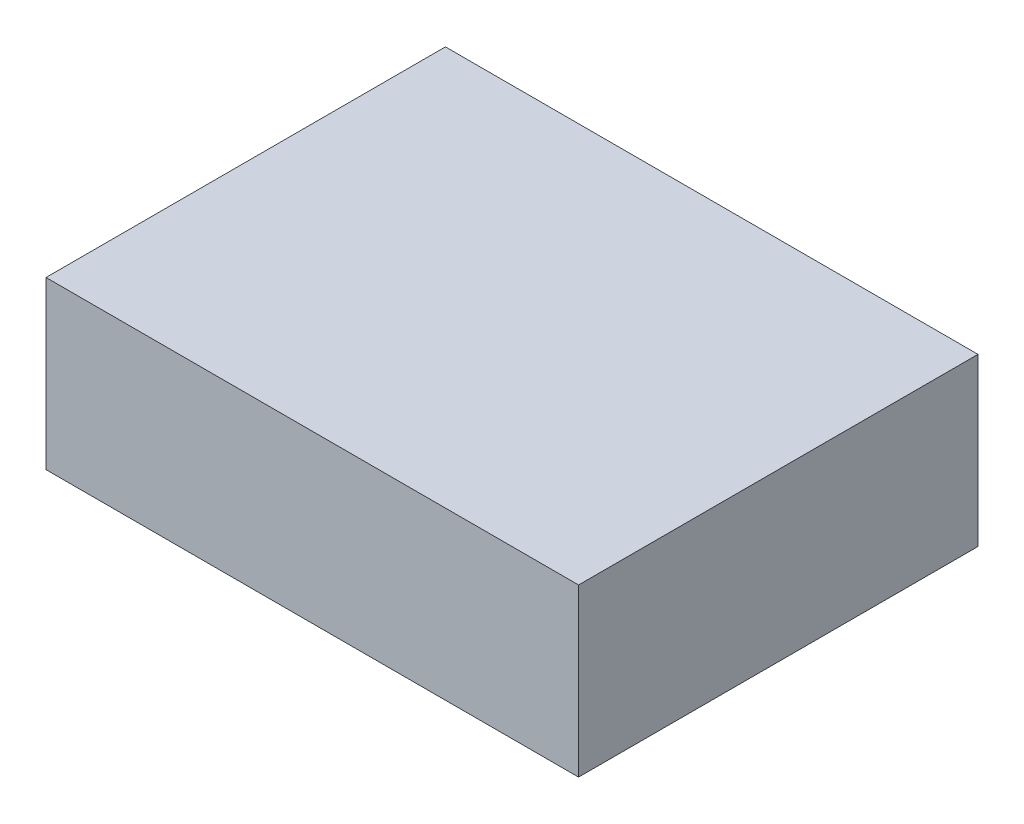
ISO-10303-21;
HEADER;
FILE_DESCRIPTION(('STEP AP214'),'2;1');
FILE_NAME('part.step','',(''),(''),'','','');
FILE_SCHEMA(('AUTOMOTIVE_DESIGN { 1 0 10303 214 1 1 1 1 }'));
ENDSEC;
DATA;
#1=APPLICATION_CONTEXT('core data for automotive mechanical design processes');
#2=APPLICATION_PROTOCOL_DEFINITION('international standard','automotive_design',2000,#1);
#3=PRODUCT_CONTEXT('',#1,'mechanical');
#4=PRODUCT('Part','Part','',(#3));
#5=PRODUCT_RELATED_PRODUCT_CATEGORY('part','',(#4));
#6=PRODUCT_DEFINITION_FORMATION('','',#4);
#7=PRODUCT_DEFINITION_CONTEXT('part definition',#1,'design');
#8=PRODUCT_DEFINITION('design','',#6,#7);
#9=PRODUCT_DEFINITION_SHAPE('','',#8);
#10=(LENGTH_UNIT() NAMED_UNIT(*) SI_UNIT(.MILLI.,.METRE.));
#11=(NAMED_UNIT(*) PLANE_ANGLE_UNIT() SI_UNIT($,.RADIAN.));
#12=(NAMED_UNIT(*) SI_UNIT($,.STERADIAN.) SOLID_ANGLE_UNIT());
#13=UNCERTAINTY_MEASURE_WITH_UNIT(LENGTH_MEASURE(1.E-05),#10,'distance_accuracy_value','');
#14=(GEOMETRIC_REPRESENTATION_CONTEXT(3) GLOBAL_UNCERTAINTY_ASSIGNED_CONTEXT((#13)) GLOBAL_UNIT_ASSIGNED_CONTEXT((#10,
#11,#12)) REPRESENTATION_CONTEXT('',''));
#15=CARTESIAN_POINT('',(0.,0.,0.));
#16=DIRECTION('',(0.,0.,1.));
#17=DIRECTION('',(1.,0.,0.));
#18=AXIS2_PLACEMENT_3D('',#15,#16,#17);
#19=CARTESIAN_POINT('',(160.,100.,-120.));
#20=DIRECTION('',(-1.,0.,0.));
#21=DIRECTION('',(0.,0.,1.));
#22=AXIS2_PLACEMENT_3D('',#19,#20,#21);
#23=PLANE('',#22);
#24=DIRECTION('',(0.,0.,-1.));
#25=VECTOR('',#24,1.);
#26=CARTESIAN_POINT('',(160.,0.,-120.));
#27=LINE('',#26,#25);
#28=CARTESIAN_POINT('',(160.,0.,120.));
#29=VERTEX_POINT('',#28);
#30=CARTESIAN_POINT('',(160.,0.,-120.));
#31=VERTEX_POINT('',#30);
#32=EDGE_CURVE('E109',#29,#31,#27,.T.);
#33=ORIENTED_EDGE('',*,*,#32,.T.);
#34=DIRECTION('',(0.,-1.,0.));
#35=VECTOR('',#34,1.);
#36=CARTESIAN_POINT('',(160.,100.,-120.));
#37=LINE('',#36,#35);
#38=CARTESIAN_POINT('',(160.,100.,-120.));
#39=VERTEX_POINT('',#38);
#40=EDGE_CURVE('E11',#39,#31,#37,.T.);
#41=ORIENTED_EDGE('',*,*,#40,.F.);
#42=DIRECTION('',(0.,0.,-1.));
#43=VECTOR('',#42,1.);
#44=CARTESIAN_POINT('',(160.,100.,-120.));
#45=LINE('',#44,#43);
#46=CARTESIAN_POINT('',(160.,100.,120.));
#47=VERTEX_POINT('',#46);
#48=EDGE_CURVE('E93',#47,#39,#45,.T.);
#49=ORIENTED_EDGE('',*,*,#48,.F.);
#50=DIRECTION('',(0.,-1.,0.));
#51=VECTOR('',#50,1.);
#52=CARTESIAN_POINT('',(160.,100.,120.));
#53=LINE('',#52,#51);
#54=EDGE_CURVE('E105',#47,#29,#53,.T.);
#55=ORIENTED_EDGE('',*,*,#54,.T.);
#56=EDGE_LOOP('',(#33,#41,#49,#55));
#57=FACE_BOUND('',#56,.T.);
#58=ADVANCED_FACE('F41',(#57),#23,.F.);
#59=CARTESIAN_POINT('',(-160.,100.,-120.));
#60=DIRECTION('',(0.,0.,1.));
#61=DIRECTION('',(1.,0.,0.));
#62=AXIS2_PLACEMENT_3D('',#59,#60,#61);
#63=PLANE('',#62);
#64=DIRECTION('',(-1.,0.,0.));
#65=VECTOR('',#64,1.);
#66=CARTESIAN_POINT('',(-160.,0.,-120.));
#67=LINE('',#66,#65);
#68=CARTESIAN_POINT('',(-160.,0.,-120.));
#69=VERTEX_POINT('',#68);
#70=EDGE_CURVE('E98',#31,#69,#67,.T.);
#71=ORIENTED_EDGE('',*,*,#70,.T.);
#72=DIRECTION('',(0.,-1.,0.));
#73=VECTOR('',#72,1.);
#74=CARTESIAN_POINT('',(-160.,100.,-120.));
#75=LINE('',#74,#73);
#76=CARTESIAN_POINT('',(-160.,100.,-120.));
#77=VERTEX_POINT('',#76);
#78=EDGE_CURVE('E50',#77,#69,#75,.T.);
#79=ORIENTED_EDGE('',*,*,#78,.F.);
#80=DIRECTION('',(-1.,0.,0.));
#81=VECTOR('',#80,1.);
#82=CARTESIAN_POINT('',(-160.,100.,-120.));
#83=LINE('',#82,#81);
#84=EDGE_CURVE('E88',#39,#77,#83,.T.);
#85=ORIENTED_EDGE('',*,*,#84,.F.);
#86=ORIENTED_EDGE('',*,*,#40,.T.);
#87=EDGE_LOOP('',(#71,#79,#85,#86));
#88=FACE_BOUND('',#87,.T.);
#89=ADVANCED_FACE('F97',(#88),#63,.F.);
#90=CARTESIAN_POINT('',(-160.,100.,-120.));
#91=DIRECTION('',(1.,0.,0.));
#92=DIRECTION('',(0.,0.,-1.));
#93=AXIS2_PLACEMENT_3D('',#90,#91,#92);
#94=PLANE('',#93);
#95=DIRECTION('',(0.,0.,1.));
#96=VECTOR('',#95,1.);
#97=CARTESIAN_POINT('',(-160.,0.,-120.));
#98=LINE('',#97,#96);
#99=CARTESIAN_POINT('',(-160.,0.,120.));
#100=VERTEX_POINT('',#99);
#101=EDGE_CURVE('E75',#69,#100,#98,.T.);
#102=ORIENTED_EDGE('',*,*,#101,.T.);
#103=DIRECTION('',(0.,-1.,0.));
#104=VECTOR('',#103,1.);
#105=CARTESIAN_POINT('',(-160.,100.,120.));
#106=LINE('',#105,#104);
#107=CARTESIAN_POINT('',(-160.,100.,120.));
#108=VERTEX_POINT('',#107);
#109=EDGE_CURVE('E100',#108,#100,#106,.T.);
#110=ORIENTED_EDGE('',*,*,#109,.F.);
#111=DIRECTION('',(0.,0.,1.));
#112=VECTOR('',#111,1.);
#113=CARTESIAN_POINT('',(-160.,100.,-120.));
#114=LINE('',#113,#112);
#115=EDGE_CURVE('E91',#77,#108,#114,.T.);
#116=ORIENTED_EDGE('',*,*,#115,.F.);
#117=ORIENTED_EDGE('',*,*,#78,.T.);
#118=EDGE_LOOP('',(#102,#110,#116,#117));
#119=FACE_BOUND('',#118,.T.);
#120=ADVANCED_FACE('F101',(#119),#94,.F.);
#121=CARTESIAN_POINT('',(-160.,100.,120.));
#122=DIRECTION('',(0.,0.,-1.));
#123=DIRECTION('',(-1.,0.,0.));
#124=AXIS2_PLACEMENT_3D('',#121,#122,#123);
#125=PLANE('',#124);
#126=DIRECTION('',(1.,0.,0.));
#127=VECTOR('',#126,1.);
#128=CARTESIAN_POINT('',(-160.,0.,120.));
#129=LINE('',#128,#127);
#130=EDGE_CURVE('E81',#100,#29,#129,.T.);
#131=ORIENTED_EDGE('',*,*,#130,.T.);
#132=ORIENTED_EDGE('',*,*,#54,.F.);
#133=DIRECTION('',(1.,0.,0.));
#134=VECTOR('',#133,1.);
#135=CARTESIAN_POINT('',(-160.,100.,120.));
#136=LINE('',#135,#134);
#137=EDGE_CURVE('E58',#108,#47,#136,.T.);
#138=ORIENTED_EDGE('',*,*,#137,.F.);
#139=ORIENTED_EDGE('',*,*,#109,.T.);
#140=EDGE_LOOP('',(#131,#132,#138,#139));
#141=FACE_BOUND('',#140,.T.);
#142=ADVANCED_FACE('F122',(#141),#125,.F.);
#143=CARTESIAN_POINT('',(0.,100.,0.));
#144=DIRECTION('',(0.,1.,0.));
#145=DIRECTION('',(0.,0.,1.));
#146=AXIS2_PLACEMENT_3D('',#143,#144,#145);
#147=PLANE('',#146);
#148=ORIENTED_EDGE('',*,*,#48,.T.);
#149=ORIENTED_EDGE('',*,*,#84,.T.);
#150=ORIENTED_EDGE('',*,*,#115,.T.);
#151=ORIENTED_EDGE('',*,*,#137,.T.);
#152=EDGE_LOOP('',(#148,#149,#150,#151));
#153=FACE_BOUND('',#152,.T.);
#154=ADVANCED_FACE('F89',(#153),#147,.T.);
#155=CARTESIAN_POINT('',(0.,0.,0.));
#156=DIRECTION('',(0.,1.,0.));
#157=DIRECTION('',(0.,0.,1.));
#158=AXIS2_PLACEMENT_3D('',#155,#156,#157);
#159=PLANE('',#158);
#160=ORIENTED_EDGE('',*,*,#32,.F.);
#161=ORIENTED_EDGE('',*,*,#130,.F.);
#162=ORIENTED_EDGE('',*,*,#101,.F.);
#163=ORIENTED_EDGE('',*,*,#70,.F.);
#164=EDGE_LOOP('',(#160,#161,#162,#163));
#165=FACE_BOUND('',#164,.T.);
#166=ADVANCED_FACE('F125',(#165),#159,.F.);
#167=CLOSED_SHELL('',(#58,#89,#120,#142,#154,#166));
#168=MANIFOLD_SOLID_BREP('B2',#167);
#169=ADVANCED_BREP_SHAPE_REPRESENTATION('',(#18,#168),#14);
#170=SHAPE_DEFINITION_REPRESENTATION(#9,#169);
ENDSEC;
END-ISO-10303-21;
